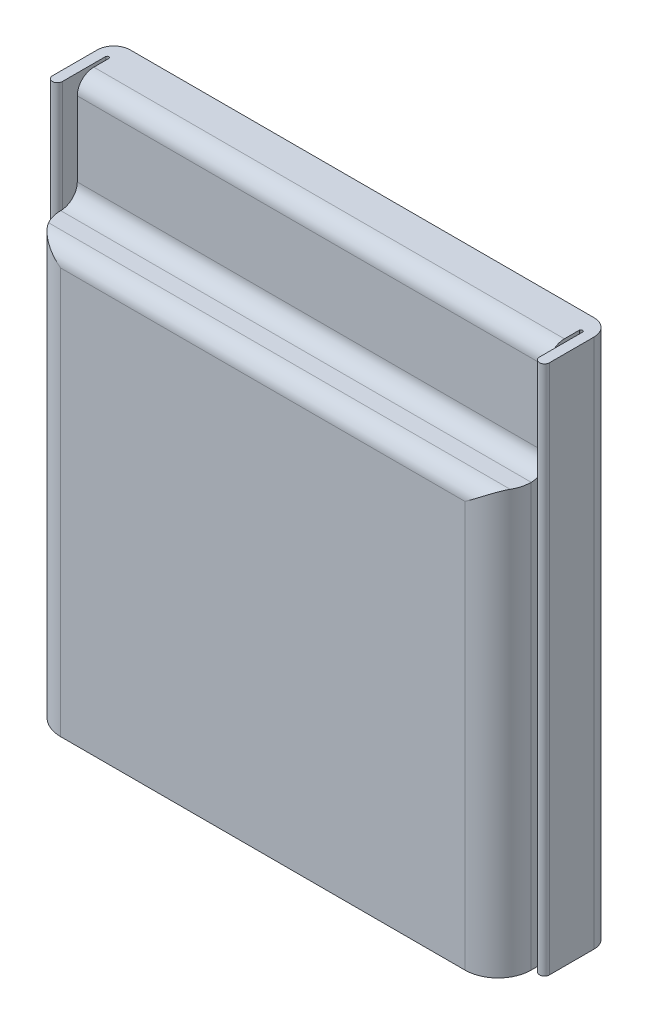
ISO-10303-21;
HEADER;
FILE_DESCRIPTION(('STEP AP214'),'2;1');
FILE_NAME('part.step','',(''),(''),'','','');
FILE_SCHEMA(('AUTOMOTIVE_DESIGN { 1 0 10303 214 1 1 1 1 }'));
ENDSEC;
DATA;
#1=APPLICATION_CONTEXT('core data for automotive mechanical design processes');
#2=APPLICATION_PROTOCOL_DEFINITION('international standard','automotive_design',2000,#1);
#3=PRODUCT_CONTEXT('',#1,'mechanical');
#4=PRODUCT('Part','Part','',(#3));
#5=PRODUCT_RELATED_PRODUCT_CATEGORY('part','',(#4));
#6=PRODUCT_DEFINITION_FORMATION('','',#4);
#7=PRODUCT_DEFINITION_CONTEXT('part definition',#1,'design');
#8=PRODUCT_DEFINITION('design','',#6,#7);
#9=PRODUCT_DEFINITION_SHAPE('','',#8);
#10=(LENGTH_UNIT() NAMED_UNIT(*) SI_UNIT(.MILLI.,.METRE.));
#11=(NAMED_UNIT(*) PLANE_ANGLE_UNIT() SI_UNIT($,.RADIAN.));
#12=(NAMED_UNIT(*) SI_UNIT($,.STERADIAN.) SOLID_ANGLE_UNIT());
#13=UNCERTAINTY_MEASURE_WITH_UNIT(LENGTH_MEASURE(1.E-05),#10,'distance_accuracy_value','');
#14=(GEOMETRIC_REPRESENTATION_CONTEXT(3) GLOBAL_UNCERTAINTY_ASSIGNED_CONTEXT((#13)) GLOBAL_UNIT_ASSIGNED_CONTEXT((#10,
#11,#12)) REPRESENTATION_CONTEXT('',''));
#15=CARTESIAN_POINT('',(0.,0.,0.));
#16=DIRECTION('',(0.,0.,1.));
#17=DIRECTION('',(1.,0.,0.));
#18=AXIS2_PLACEMENT_3D('',#15,#16,#17);
#19=CARTESIAN_POINT('',(-14.2,16.,4.));
#20=DIRECTION('',(1.,0.,0.));
#21=DIRECTION('',(0.,0.,-1.));
#22=AXIS2_PLACEMENT_3D('',#19,#20,#21);
#23=PLANE('',#22);
#24=CARTESIAN_POINT('',(-14.2,15.,2.));
#25=DIRECTION('',(1.,0.,0.));
#26=DIRECTION('',(0.,0.,-1.));
#27=AXIS2_PLACEMENT_3D('',#24,#25,#26);
#28=CIRCLE('',#27,0.999999999999999);
#29=CARTESIAN_POINT('',(-14.2,16.,2.));
#30=VERTEX_POINT('',#29);
#31=CARTESIAN_POINT('',(-14.2,15.,3.));
#32=VERTEX_POINT('',#31);
#33=EDGE_CURVE('E312',#30,#32,#28,.T.);
#34=ORIENTED_EDGE('',*,*,#33,.F.);
#35=DIRECTION('',(0.,0.,1.));
#36=VECTOR('',#35,1.);
#37=CARTESIAN_POINT('',(-14.2,16.,4.));
#38=LINE('',#37,#36);
#39=CARTESIAN_POINT('',(-14.2,16.,1.1));
#40=VERTEX_POINT('',#39);
#41=EDGE_CURVE('E268',#40,#30,#38,.T.);
#42=ORIENTED_EDGE('',*,*,#41,.F.);
#43=DIRECTION('',(0.,-1.,0.));
#44=VECTOR('',#43,1.);
#45=CARTESIAN_POINT('',(-14.2,16.,1.1));
#46=LINE('',#45,#44);
#47=CARTESIAN_POINT('',(-14.2,-16.,1.1));
#48=VERTEX_POINT('',#47);
#49=EDGE_CURVE('E236',#40,#48,#46,.T.);
#50=ORIENTED_EDGE('',*,*,#49,.T.);
#51=DIRECTION('',(0.,0.,1.));
#52=VECTOR('',#51,1.);
#53=CARTESIAN_POINT('',(-14.2,-16.,4.));
#54=LINE('',#53,#52);
#55=CARTESIAN_POINT('',(-14.2,-16.,4.));
#56=VERTEX_POINT('',#55);
#57=EDGE_CURVE('E191',#48,#56,#54,.T.);
#58=ORIENTED_EDGE('',*,*,#57,.T.);
#59=DIRECTION('',(0.,-1.,0.));
#60=VECTOR('',#59,1.);
#61=CARTESIAN_POINT('',(-14.2,16.,4.));
#62=LINE('',#61,#60);
#63=CARTESIAN_POINT('',(-14.2,9.5,4.));
#64=VERTEX_POINT('',#63);
#65=EDGE_CURVE('E234',#64,#56,#62,.T.);
#66=ORIENTED_EDGE('',*,*,#65,.F.);
#67=CARTESIAN_POINT('',(-14.2,10.5,4.));
#68=DIRECTION('',(1.,0.,0.));
#69=DIRECTION('',(0.,0.,-1.));
#70=AXIS2_PLACEMENT_3D('',#67,#68,#69);
#71=CIRCLE('',#70,1.);
#72=CARTESIAN_POINT('',(-14.2,10.5,3.));
#73=VERTEX_POINT('',#72);
#74=EDGE_CURVE('E540',#73,#64,#71,.F.);
#75=ORIENTED_EDGE('',*,*,#74,.F.);
#76=DIRECTION('',(0.,-1.,0.));
#77=VECTOR('',#76,1.);
#78=CARTESIAN_POINT('',(-14.2,15.,3.));
#79=LINE('',#78,#77);
#80=EDGE_CURVE('E545',#32,#73,#79,.T.);
#81=ORIENTED_EDGE('',*,*,#80,.F.);
#82=EDGE_LOOP('',(#34,#42,#50,#58,#66,#75,#81));
#83=FACE_BOUND('',#82,.T.);
#84=ADVANCED_FACE('F34',(#83),#23,.F.);
#85=CARTESIAN_POINT('',(-12.2,16.,4.));
#86=DIRECTION('',(0.,-1.,0.));
#87=DIRECTION('',(0.,0.,-1.));
#88=AXIS2_PLACEMENT_3D('',#85,#86,#87);
#89=CYLINDRICAL_SURFACE('',#88,2.);
#90=CARTESIAN_POINT('',(-13.9320508075689,9.5,5.));
#91=CARTESIAN_POINT('',(-13.9104388092232,9.50000019431164,5.03745955952634));
#92=CARTESIAN_POINT('',(-13.8876150380169,9.49789680203802,5.07416082135288));
#93=CARTESIAN_POINT('',(-13.8399082789937,9.48998659235742,5.14565643679948));
#94=CARTESIAN_POINT('',(-13.8150306479842,9.4841891596109,5.18045538068582));
#95=CARTESIAN_POINT('',(-13.7638095986444,9.46948764080384,5.24750155484404));
#96=CARTESIAN_POINT('',(-13.7374899659552,9.46062573015755,5.27977648315568));
#97=CARTESIAN_POINT('',(-13.6833456141586,9.4402147841779,5.34216028206818));
#98=CARTESIAN_POINT('',(-13.6555197975357,9.42866376857337,5.37226753488461));
#99=CARTESIAN_POINT('',(-13.5593531507906,9.38576723248944,5.47019811807823));
#100=CARTESIAN_POINT('',(-13.4880193488669,9.34907849657492,5.53282562568266));
#101=CARTESIAN_POINT('',(-13.340363739478,9.26681233160586,5.64568917095705));
#102=CARTESIAN_POINT('',(-13.2640143376998,9.22118241178421,5.69584785903709));
#103=CARTESIAN_POINT('',(-13.0766007270823,9.10433459554444,5.80205524109828));
#104=CARTESIAN_POINT('',(-12.9640093602241,9.03024184432857,5.85225042506979));
#105=CARTESIAN_POINT('',(-12.7358987111728,8.87602060504642,5.93063722515178));
#106=CARTESIAN_POINT('',(-12.6203834138029,8.79590006593695,5.9588572812851));
#107=CARTESIAN_POINT('',(-12.4055282598134,8.64531643885113,5.99190926969969));
#108=CARTESIAN_POINT('',(-12.3063744279377,8.57521774765431,5.99962510423665));
#109=CARTESIAN_POINT('',(-12.2048685950783,8.50344261611525,5.99999555089123));
#110=CARTESIAN_POINT('',(-12.2024342684886,8.50172128716943,5.99999999481595));
#111=CARTESIAN_POINT('',(-12.2,8.5,6.));
#112=B_SPLINE_CURVE_WITH_KNOTS('',3,(#90,#91,#92,#93,#94,#95,#96,#97,#98,#99,#100,#101,#102,
#103,#104,#105,#106,#107,#108,#109,#110,#111),.UNSPECIFIED.,.F.,.F.,(4,2,2,2,2,2,2,2,2,2,4),(0.,
0.129592295294554,0.258856668652717,0.38640850926838,0.514054578529991,0.817592410147257,
1.1229686971365,1.55212503753214,1.98072504008938,2.34472916750578,2.35367344935465),.UNSPECIFIED.);
#113=CARTESIAN_POINT('',(-13.9320508075689,9.5,5.));
#114=VERTEX_POINT('',#113);
#115=CARTESIAN_POINT('',(-12.2,8.5,6.));
#116=VERTEX_POINT('',#115);
#117=EDGE_CURVE('E549',#114,#116,#112,.T.);
#118=ORIENTED_EDGE('',*,*,#117,.F.);
#119=CARTESIAN_POINT('',(-12.2,9.5,4.));
#120=DIRECTION('',(0.,-1.,0.));
#121=DIRECTION('',(0.,0.,-1.));
#122=AXIS2_PLACEMENT_3D('',#119,#120,#121);
#123=CIRCLE('',#122,2.);
#124=EDGE_CURVE('E531',#64,#114,#123,.F.);
#125=ORIENTED_EDGE('',*,*,#124,.F.);
#126=ORIENTED_EDGE('',*,*,#65,.T.);
#127=CARTESIAN_POINT('',(-12.2,-16.,4.));
#128=DIRECTION('',(0.,1.,0.));
#129=DIRECTION('',(0.,0.,1.));
#130=AXIS2_PLACEMENT_3D('',#127,#128,#129);
#131=CIRCLE('',#130,2.);
#132=CARTESIAN_POINT('',(-12.2,-16.,6.));
#133=VERTEX_POINT('',#132);
#134=EDGE_CURVE('E194',#56,#133,#131,.T.);
#135=ORIENTED_EDGE('',*,*,#134,.T.);
#136=DIRECTION('',(0.,-1.,0.));
#137=VECTOR('',#136,1.);
#138=CARTESIAN_POINT('',(-12.2,16.,6.));
#139=LINE('',#138,#137);
#140=EDGE_CURVE('E232',#116,#133,#139,.T.);
#141=ORIENTED_EDGE('',*,*,#140,.F.);
#142=EDGE_LOOP('',(#118,#125,#126,#135,#141));
#143=FACE_BOUND('',#142,.T.);
#144=ADVANCED_FACE('F367',(#143),#89,.T.);
#145=CARTESIAN_POINT('',(12.2,16.,4.));
#146=DIRECTION('',(0.,-1.,0.));
#147=DIRECTION('',(0.,0.,-1.));
#148=AXIS2_PLACEMENT_3D('',#145,#146,#147);
#149=CYLINDRICAL_SURFACE('',#148,2.);
#150=CARTESIAN_POINT('',(13.9320508075689,9.5,5.));
#151=CARTESIAN_POINT('',(13.9104388092232,9.50000019431164,5.03745955952635));
#152=CARTESIAN_POINT('',(13.8876150380168,9.49789680203802,5.0741608213529));
#153=CARTESIAN_POINT('',(13.8399082789937,9.48998659235741,5.14565643679952));
#154=CARTESIAN_POINT('',(13.8150306479842,9.48418915961089,5.18045538068586));
#155=CARTESIAN_POINT('',(13.7638095986444,9.46948764080383,5.24750155484409));
#156=CARTESIAN_POINT('',(13.7374899659552,9.46062573015754,5.27977648315572));
#157=CARTESIAN_POINT('',(13.6833456141586,9.4402147841779,5.3421602820682));
#158=CARTESIAN_POINT('',(13.6555197975357,9.42866376857337,5.37226753488462));
#159=CARTESIAN_POINT('',(13.5593531507907,9.38576723248944,5.47019811807823));
#160=CARTESIAN_POINT('',(13.488019348867,9.34907849657491,5.53282562568265));
#161=CARTESIAN_POINT('',(13.3403637394781,9.26681233160589,5.64568917095703));
#162=CARTESIAN_POINT('',(13.2640143376997,9.22118241178428,5.69584785903708));
#163=CARTESIAN_POINT('',(13.0766007270824,9.10433459554433,5.80205524109829));
#164=CARTESIAN_POINT('',(12.9640093602244,9.03024184432811,5.8522504250698));
#165=CARTESIAN_POINT('',(12.7358987111725,8.87602060504685,5.93063722515179));
#166=CARTESIAN_POINT('',(12.6203834138018,8.79590006593861,5.95885728128509));
#167=CARTESIAN_POINT('',(12.4055282598144,8.64531643884971,5.9919092696997));
#168=CARTESIAN_POINT('',(12.3063744279412,8.57521774764938,5.99962510423667));
#169=CARTESIAN_POINT('',(12.2048685950784,8.50344261611501,5.99999555089123));
#170=CARTESIAN_POINT('',(12.2024342684887,8.50172128716931,5.99999999481595));
#171=CARTESIAN_POINT('',(12.2,8.5,6.));
#172=B_SPLINE_CURVE_WITH_KNOTS('',3,(#150,#151,#152,#153,#154,#155,#156,#157,#158,#159,#160,
#161,#162,#163,#164,#165,#166,#167,#168,#169,#170,#171),.UNSPECIFIED.,.F.,.F.,(4,2,2,2,2,2,2,2,
2,2,4),(0.,0.129592295294589,0.258856668652789,0.386408509268417,0.51405457852999,
0.817592410147213,1.1229686971365,1.55212503753219,1.98072504008937,2.34472916750578,
2.35367344935466),.UNSPECIFIED.);
#173=CARTESIAN_POINT('',(13.9320508075689,9.5,5.));
#174=VERTEX_POINT('',#173);
#175=CARTESIAN_POINT('',(12.2,8.5,6.));
#176=VERTEX_POINT('',#175);
#177=EDGE_CURVE('E305',#174,#176,#172,.T.);
#178=ORIENTED_EDGE('',*,*,#177,.T.);
#179=DIRECTION('',(0.,-1.,0.));
#180=VECTOR('',#179,1.);
#181=CARTESIAN_POINT('',(12.2,16.,6.));
#182=LINE('',#181,#180);
#183=CARTESIAN_POINT('',(12.2,-16.,6.));
#184=VERTEX_POINT('',#183);
#185=EDGE_CURVE('E230',#176,#184,#182,.T.);
#186=ORIENTED_EDGE('',*,*,#185,.T.);
#187=CARTESIAN_POINT('',(12.2,-16.,4.));
#188=DIRECTION('',(0.,1.,0.));
#189=DIRECTION('',(0.,0.,-1.));
#190=AXIS2_PLACEMENT_3D('',#187,#188,#189);
#191=CIRCLE('',#190,2.);
#192=CARTESIAN_POINT('',(14.2,-16.,4.));
#193=VERTEX_POINT('',#192);
#194=EDGE_CURVE('E200',#184,#193,#191,.T.);
#195=ORIENTED_EDGE('',*,*,#194,.T.);
#196=DIRECTION('',(0.,-1.,0.));
#197=VECTOR('',#196,1.);
#198=CARTESIAN_POINT('',(14.2,16.,4.));
#199=LINE('',#198,#197);
#200=CARTESIAN_POINT('',(14.2,9.5,4.));
#201=VERTEX_POINT('',#200);
#202=EDGE_CURVE('E228',#201,#193,#199,.T.);
#203=ORIENTED_EDGE('',*,*,#202,.F.);
#204=CARTESIAN_POINT('',(12.2,9.5,4.));
#205=DIRECTION('',(0.,1.,0.));
#206=DIRECTION('',(0.,0.,1.));
#207=AXIS2_PLACEMENT_3D('',#204,#205,#206);
#208=CIRCLE('',#207,2.);
#209=EDGE_CURVE('E535',#201,#174,#208,.F.);
#210=ORIENTED_EDGE('',*,*,#209,.T.);
#211=EDGE_LOOP('',(#178,#186,#195,#203,#210));
#212=FACE_BOUND('',#211,.T.);
#213=ADVANCED_FACE('F363',(#212),#149,.T.);
#214=CARTESIAN_POINT('',(14.2,16.,1.1));
#215=DIRECTION('',(-1.,0.,0.));
#216=DIRECTION('',(0.,0.,1.));
#217=AXIS2_PLACEMENT_3D('',#214,#215,#216);
#218=PLANE('',#217);
#219=CARTESIAN_POINT('',(14.2,15.,2.));
#220=DIRECTION('',(-1.,0.,0.));
#221=DIRECTION('',(0.,0.,1.));
#222=AXIS2_PLACEMENT_3D('',#219,#220,#221);
#223=CIRCLE('',#222,0.999999999999999);
#224=CARTESIAN_POINT('',(14.2,16.,2.));
#225=VERTEX_POINT('',#224);
#226=CARTESIAN_POINT('',(14.2,15.,3.));
#227=VERTEX_POINT('',#226);
#228=EDGE_CURVE('E49',#225,#227,#223,.F.);
#229=ORIENTED_EDGE('',*,*,#228,.T.);
#230=DIRECTION('',(0.,-1.,0.));
#231=VECTOR('',#230,1.);
#232=CARTESIAN_POINT('',(14.2,15.,3.));
#233=LINE('',#232,#231);
#234=CARTESIAN_POINT('',(14.2,10.5,3.));
#235=VERTEX_POINT('',#234);
#236=EDGE_CURVE('E303',#227,#235,#233,.T.);
#237=ORIENTED_EDGE('',*,*,#236,.T.);
#238=CARTESIAN_POINT('',(14.2,10.5,4.));
#239=DIRECTION('',(-1.,0.,0.));
#240=DIRECTION('',(0.,0.,1.));
#241=AXIS2_PLACEMENT_3D('',#238,#239,#240);
#242=CIRCLE('',#241,1.);
#243=EDGE_CURVE('E306',#235,#201,#242,.T.);
#244=ORIENTED_EDGE('',*,*,#243,.T.);
#245=ORIENTED_EDGE('',*,*,#202,.T.);
#246=DIRECTION('',(0.,0.,-1.));
#247=VECTOR('',#246,1.);
#248=CARTESIAN_POINT('',(14.2,-16.,1.1));
#249=LINE('',#248,#247);
#250=CARTESIAN_POINT('',(14.2,-16.,1.1));
#251=VERTEX_POINT('',#250);
#252=EDGE_CURVE('E203',#193,#251,#249,.T.);
#253=ORIENTED_EDGE('',*,*,#252,.T.);
#254=DIRECTION('',(0.,-1.,0.));
#255=VECTOR('',#254,1.);
#256=CARTESIAN_POINT('',(14.2,16.,1.1));
#257=LINE('',#256,#255);
#258=CARTESIAN_POINT('',(14.2,16.,1.1));
#259=VERTEX_POINT('',#258);
#260=EDGE_CURVE('E225',#259,#251,#257,.T.);
#261=ORIENTED_EDGE('',*,*,#260,.F.);
#262=DIRECTION('',(0.,0.,-1.));
#263=VECTOR('',#262,1.);
#264=CARTESIAN_POINT('',(14.2,16.,1.1));
#265=LINE('',#264,#263);
#266=EDGE_CURVE('E271',#225,#259,#265,.T.);
#267=ORIENTED_EDGE('',*,*,#266,.F.);
#268=EDGE_LOOP('',(#229,#237,#244,#245,#253,#261,#267));
#269=FACE_BOUND('',#268,.T.);
#270=ADVANCED_FACE('F360',(#269),#218,.F.);
#271=CARTESIAN_POINT('',(-14.,16.,1.));
#272=DIRECTION('',(0.,-1.,0.));
#273=DIRECTION('',(0.,0.,-1.));
#274=AXIS2_PLACEMENT_3D('',#271,#272,#273);
#275=CYLINDRICAL_SURFACE('',#274,1.);
#276=CARTESIAN_POINT('',(-14.,-16.,1.));
#277=DIRECTION('',(0.,1.,0.));
#278=DIRECTION('',(0.,0.,1.));
#279=AXIS2_PLACEMENT_3D('',#276,#277,#278);
#280=CIRCLE('',#279,1.);
#281=CARTESIAN_POINT('',(-14.,-16.,0.));
#282=VERTEX_POINT('',#281);
#283=CARTESIAN_POINT('',(-15.,-16.,1.));
#284=VERTEX_POINT('',#283);
#285=EDGE_CURVE('E179',#282,#284,#280,.T.);
#286=ORIENTED_EDGE('',*,*,#285,.T.);
#287=DIRECTION('',(0.,-1.,0.));
#288=VECTOR('',#287,1.);
#289=CARTESIAN_POINT('',(-15.,16.,1.));
#290=LINE('',#289,#288);
#291=CARTESIAN_POINT('',(-15.,16.,1.));
#292=VERTEX_POINT('',#291);
#293=EDGE_CURVE('E11',#292,#284,#290,.T.);
#294=ORIENTED_EDGE('',*,*,#293,.F.);
#295=CARTESIAN_POINT('',(-14.,16.,1.));
#296=DIRECTION('',(0.,1.,0.));
#297=DIRECTION('',(0.,0.,1.));
#298=AXIS2_PLACEMENT_3D('',#295,#296,#297);
#299=CIRCLE('',#298,1.);
#300=CARTESIAN_POINT('',(-14.,16.,0.));
#301=VERTEX_POINT('',#300);
#302=EDGE_CURVE('E215',#301,#292,#299,.T.);
#303=ORIENTED_EDGE('',*,*,#302,.F.);
#304=DIRECTION('',(0.,-1.,0.));
#305=VECTOR('',#304,1.);
#306=CARTESIAN_POINT('',(-14.,16.,0.));
#307=LINE('',#306,#305);
#308=EDGE_CURVE('E175',#301,#282,#307,.T.);
#309=ORIENTED_EDGE('',*,*,#308,.T.);
#310=EDGE_LOOP('',(#286,#294,#303,#309));
#311=FACE_BOUND('',#310,.T.);
#312=ADVANCED_FACE('F36',(#311),#275,.T.);
#313=CARTESIAN_POINT('',(-15.,16.,1.));
#314=DIRECTION('',(1.,0.,0.));
#315=DIRECTION('',(0.,0.,-1.));
#316=AXIS2_PLACEMENT_3D('',#313,#314,#315);
#317=PLANE('',#316);
#318=DIRECTION('',(0.,0.,1.));
#319=VECTOR('',#318,1.);
#320=CARTESIAN_POINT('',(-15.,-16.,1.));
#321=LINE('',#320,#319);
#322=CARTESIAN_POINT('',(-15.,-16.,3.7));
#323=VERTEX_POINT('',#322);
#324=EDGE_CURVE('E182',#284,#323,#321,.T.);
#325=ORIENTED_EDGE('',*,*,#324,.T.);
#326=DIRECTION('',(0.,-1.,0.));
#327=VECTOR('',#326,1.);
#328=CARTESIAN_POINT('',(-15.,16.,3.7));
#329=LINE('',#328,#327);
#330=CARTESIAN_POINT('',(-15.,16.,3.7));
#331=VERTEX_POINT('',#330);
#332=EDGE_CURVE('E42',#331,#323,#329,.T.);
#333=ORIENTED_EDGE('',*,*,#332,.F.);
#334=DIRECTION('',(0.,0.,1.));
#335=VECTOR('',#334,1.);
#336=CARTESIAN_POINT('',(-15.,16.,1.));
#337=LINE('',#336,#335);
#338=EDGE_CURVE('E123',#292,#331,#337,.T.);
#339=ORIENTED_EDGE('',*,*,#338,.F.);
#340=ORIENTED_EDGE('',*,*,#293,.T.);
#341=EDGE_LOOP('',(#325,#333,#339,#340));
#342=FACE_BOUND('',#341,.T.);
#343=ADVANCED_FACE('F383',(#342),#317,.F.);
#344=CARTESIAN_POINT('',(-14.7,16.,3.7));
#345=DIRECTION('',(0.,-1.,0.));
#346=DIRECTION('',(0.,0.,-1.));
#347=AXIS2_PLACEMENT_3D('',#344,#345,#346);
#348=CYLINDRICAL_SURFACE('',#347,0.3);
#349=CARTESIAN_POINT('',(-14.7,-16.,3.7));
#350=DIRECTION('',(0.,1.,0.));
#351=DIRECTION('',(0.,0.,1.));
#352=AXIS2_PLACEMENT_3D('',#349,#350,#351);
#353=CIRCLE('',#352,0.3);
#354=CARTESIAN_POINT('',(-14.4,-16.,3.7));
#355=VERTEX_POINT('',#354);
#356=EDGE_CURVE('E185',#323,#355,#353,.T.);
#357=ORIENTED_EDGE('',*,*,#356,.T.);
#358=DIRECTION('',(0.,-1.,0.));
#359=VECTOR('',#358,1.);
#360=CARTESIAN_POINT('',(-14.4,16.,3.7));
#361=LINE('',#360,#359);
#362=CARTESIAN_POINT('',(-14.4,16.,3.7));
#363=VERTEX_POINT('',#362);
#364=EDGE_CURVE('E242',#363,#355,#361,.T.);
#365=ORIENTED_EDGE('',*,*,#364,.F.);
#366=CARTESIAN_POINT('',(-14.7,16.,3.7));
#367=DIRECTION('',(0.,1.,0.));
#368=DIRECTION('',(0.,0.,1.));
#369=AXIS2_PLACEMENT_3D('',#366,#367,#368);
#370=CIRCLE('',#369,0.3);
#371=EDGE_CURVE('E250',#331,#363,#370,.T.);
#372=ORIENTED_EDGE('',*,*,#371,.F.);
#373=ORIENTED_EDGE('',*,*,#332,.T.);
#374=EDGE_LOOP('',(#357,#365,#372,#373));
#375=FACE_BOUND('',#374,.T.);
#376=ADVANCED_FACE('F248',(#375),#348,.T.);
#377=CARTESIAN_POINT('',(-14.4,16.,3.7));
#378=DIRECTION('',(-1.,0.,0.));
#379=DIRECTION('',(0.,0.,1.));
#380=AXIS2_PLACEMENT_3D('',#377,#378,#379);
#381=PLANE('',#380);
#382=DIRECTION('',(0.,0.,-1.));
#383=VECTOR('',#382,1.);
#384=CARTESIAN_POINT('',(-14.4,-16.,3.7));
#385=LINE('',#384,#383);
#386=CARTESIAN_POINT('',(-14.4,-16.,1.1));
#387=VERTEX_POINT('',#386);
#388=EDGE_CURVE('E187',#355,#387,#385,.T.);
#389=ORIENTED_EDGE('',*,*,#388,.T.);
#390=DIRECTION('',(0.,-1.,0.));
#391=VECTOR('',#390,1.);
#392=CARTESIAN_POINT('',(-14.4,16.,1.1));
#393=LINE('',#392,#391);
#394=CARTESIAN_POINT('',(-14.4,16.,1.1));
#395=VERTEX_POINT('',#394);
#396=EDGE_CURVE('E239',#395,#387,#393,.T.);
#397=ORIENTED_EDGE('',*,*,#396,.F.);
#398=DIRECTION('',(0.,0.,-1.));
#399=VECTOR('',#398,1.);
#400=CARTESIAN_POINT('',(-14.4,16.,3.7));
#401=LINE('',#400,#399);
#402=EDGE_CURVE('E269',#363,#395,#401,.T.);
#403=ORIENTED_EDGE('',*,*,#402,.F.);
#404=ORIENTED_EDGE('',*,*,#364,.T.);
#405=EDGE_LOOP('',(#389,#397,#403,#404));
#406=FACE_BOUND('',#405,.T.);
#407=ADVANCED_FACE('F259',(#406),#381,.F.);
#408=CARTESIAN_POINT('',(-14.3,16.,1.1));
#409=DIRECTION('',(0.,-1.,0.));
#410=DIRECTION('',(0.,0.,-1.));
#411=AXIS2_PLACEMENT_3D('',#408,#409,#410);
#412=CYLINDRICAL_SURFACE('',#411,0.100000000000003);
#413=CARTESIAN_POINT('',(-14.3,-16.,1.1));
#414=DIRECTION('',(0.,-1.,0.));
#415=DIRECTION('',(0.,0.,1.));
#416=AXIS2_PLACEMENT_3D('',#413,#414,#415);
#417=CIRCLE('',#416,0.100000000000003);
#418=EDGE_CURVE('E189',#387,#48,#417,.T.);
#419=ORIENTED_EDGE('',*,*,#418,.T.);
#420=ORIENTED_EDGE('',*,*,#49,.F.);
#421=CARTESIAN_POINT('',(-14.3,16.,1.1));
#422=DIRECTION('',(0.,-1.,0.));
#423=DIRECTION('',(0.,0.,1.));
#424=AXIS2_PLACEMENT_3D('',#421,#422,#423);
#425=CIRCLE('',#424,0.100000000000003);
#426=EDGE_CURVE('E265',#395,#40,#425,.T.);
#427=ORIENTED_EDGE('',*,*,#426,.F.);
#428=ORIENTED_EDGE('',*,*,#396,.T.);
#429=EDGE_LOOP('',(#419,#420,#427,#428));
#430=FACE_BOUND('',#429,.T.);
#431=ADVANCED_FACE('F263',(#430),#412,.F.);
#432=CARTESIAN_POINT('',(-12.2,16.,6.));
#433=DIRECTION('',(0.,0.,-1.));
#434=DIRECTION('',(-1.,0.,0.));
#435=AXIS2_PLACEMENT_3D('',#432,#433,#434);
#436=PLANE('',#435);
#437=ORIENTED_EDGE('',*,*,#185,.F.);
#438=DIRECTION('',(-1.,0.,0.));
#439=VECTOR('',#438,1.);
#440=CARTESIAN_POINT('',(15.001,8.5,6.));
#441=LINE('',#440,#439);
#442=EDGE_CURVE('E321',#176,#116,#441,.T.);
#443=ORIENTED_EDGE('',*,*,#442,.T.);
#444=ORIENTED_EDGE('',*,*,#140,.T.);
#445=DIRECTION('',(1.,0.,0.));
#446=VECTOR('',#445,1.);
#447=CARTESIAN_POINT('',(-12.2,-16.,6.));
#448=LINE('',#447,#446);
#449=EDGE_CURVE('E197',#133,#184,#448,.T.);
#450=ORIENTED_EDGE('',*,*,#449,.T.);
#451=EDGE_LOOP('',(#437,#443,#444,#450));
#452=FACE_BOUND('',#451,.T.);
#453=ADVANCED_FACE('F358',(#452),#436,.F.);
#454=CARTESIAN_POINT('',(14.3,16.,1.1));
#455=DIRECTION('',(0.,-1.,0.));
#456=DIRECTION('',(0.,0.,-1.));
#457=AXIS2_PLACEMENT_3D('',#454,#455,#456);
#458=CYLINDRICAL_SURFACE('',#457,0.0999999999999994);
#459=CARTESIAN_POINT('',(14.3,-16.,1.1));
#460=DIRECTION('',(0.,-1.,0.));
#461=DIRECTION('',(0.,0.,-1.));
#462=AXIS2_PLACEMENT_3D('',#459,#460,#461);
#463=CIRCLE('',#462,0.0999999999999994);
#464=CARTESIAN_POINT('',(14.4,-16.,1.1));
#465=VERTEX_POINT('',#464);
#466=EDGE_CURVE('E205',#251,#465,#463,.T.);
#467=ORIENTED_EDGE('',*,*,#466,.T.);
#468=DIRECTION('',(0.,-1.,0.));
#469=VECTOR('',#468,1.);
#470=CARTESIAN_POINT('',(14.4,16.,1.1));
#471=LINE('',#470,#469);
#472=CARTESIAN_POINT('',(14.4,16.,1.1));
#473=VERTEX_POINT('',#472);
#474=EDGE_CURVE('E222',#473,#465,#471,.T.);
#475=ORIENTED_EDGE('',*,*,#474,.F.);
#476=CARTESIAN_POINT('',(14.3,16.,1.1));
#477=DIRECTION('',(0.,-1.,0.));
#478=DIRECTION('',(0.,0.,-1.));
#479=AXIS2_PLACEMENT_3D('',#476,#477,#478);
#480=CIRCLE('',#479,0.0999999999999994);
#481=EDGE_CURVE('E277',#259,#473,#480,.T.);
#482=ORIENTED_EDGE('',*,*,#481,.F.);
#483=ORIENTED_EDGE('',*,*,#260,.T.);
#484=EDGE_LOOP('',(#467,#475,#482,#483));
#485=FACE_BOUND('',#484,.T.);
#486=ADVANCED_FACE('F355',(#485),#458,.F.);
#487=CARTESIAN_POINT('',(14.4,16.,3.7));
#488=DIRECTION('',(1.,0.,0.));
#489=DIRECTION('',(0.,0.,-1.));
#490=AXIS2_PLACEMENT_3D('',#487,#488,#489);
#491=PLANE('',#490);
#492=DIRECTION('',(0.,0.,1.));
#493=VECTOR('',#492,1.);
#494=CARTESIAN_POINT('',(14.4,-16.,3.7));
#495=LINE('',#494,#493);
#496=CARTESIAN_POINT('',(14.4,-16.,3.7));
#497=VERTEX_POINT('',#496);
#498=EDGE_CURVE('E207',#465,#497,#495,.T.);
#499=ORIENTED_EDGE('',*,*,#498,.T.);
#500=DIRECTION('',(0.,-1.,0.));
#501=VECTOR('',#500,1.);
#502=CARTESIAN_POINT('',(14.4,16.,3.7));
#503=LINE('',#502,#501);
#504=CARTESIAN_POINT('',(14.4,16.,3.7));
#505=VERTEX_POINT('',#504);
#506=EDGE_CURVE('E219',#505,#497,#503,.T.);
#507=ORIENTED_EDGE('',*,*,#506,.F.);
#508=DIRECTION('',(0.,0.,1.));
#509=VECTOR('',#508,1.);
#510=CARTESIAN_POINT('',(14.4,16.,3.7));
#511=LINE('',#510,#509);
#512=EDGE_CURVE('E279',#473,#505,#511,.T.);
#513=ORIENTED_EDGE('',*,*,#512,.F.);
#514=ORIENTED_EDGE('',*,*,#474,.T.);
#515=EDGE_LOOP('',(#499,#507,#513,#514));
#516=FACE_BOUND('',#515,.T.);
#517=ADVANCED_FACE('F285',(#516),#491,.F.);
#518=CARTESIAN_POINT('',(14.7,16.,3.7));
#519=DIRECTION('',(0.,-1.,0.));
#520=DIRECTION('',(0.,0.,-1.));
#521=AXIS2_PLACEMENT_3D('',#518,#519,#520);
#522=CYLINDRICAL_SURFACE('',#521,0.300000000000002);
#523=CARTESIAN_POINT('',(14.7,-16.,3.7));
#524=DIRECTION('',(0.,1.,0.));
#525=DIRECTION('',(0.,0.,-1.));
#526=AXIS2_PLACEMENT_3D('',#523,#524,#525);
#527=CIRCLE('',#526,0.300000000000002);
#528=CARTESIAN_POINT('',(15.,-16.,3.7));
#529=VERTEX_POINT('',#528);
#530=EDGE_CURVE('E209',#497,#529,#527,.T.);
#531=ORIENTED_EDGE('',*,*,#530,.T.);
#532=DIRECTION('',(0.,-1.,0.));
#533=VECTOR('',#532,1.);
#534=CARTESIAN_POINT('',(15.,16.,3.7));
#535=LINE('',#534,#533);
#536=CARTESIAN_POINT('',(15.,16.,3.7));
#537=VERTEX_POINT('',#536);
#538=EDGE_CURVE('E170',#537,#529,#535,.T.);
#539=ORIENTED_EDGE('',*,*,#538,.F.);
#540=CARTESIAN_POINT('',(14.7,16.,3.7));
#541=DIRECTION('',(0.,1.,0.));
#542=DIRECTION('',(0.,0.,-1.));
#543=AXIS2_PLACEMENT_3D('',#540,#541,#542);
#544=CIRCLE('',#543,0.300000000000002);
#545=EDGE_CURVE('E158',#505,#537,#544,.T.);
#546=ORIENTED_EDGE('',*,*,#545,.F.);
#547=ORIENTED_EDGE('',*,*,#506,.T.);
#548=EDGE_LOOP('',(#531,#539,#546,#547));
#549=FACE_BOUND('',#548,.T.);
#550=ADVANCED_FACE('F289',(#549),#522,.T.);
#551=CARTESIAN_POINT('',(15.,16.,1.));
#552=DIRECTION('',(-1.,0.,0.));
#553=DIRECTION('',(0.,0.,1.));
#554=AXIS2_PLACEMENT_3D('',#551,#552,#553);
#555=PLANE('',#554);
#556=DIRECTION('',(0.,0.,-1.));
#557=VECTOR('',#556,1.);
#558=CARTESIAN_POINT('',(15.,-16.,1.));
#559=LINE('',#558,#557);
#560=CARTESIAN_POINT('',(15.,-16.,1.));
#561=VERTEX_POINT('',#560);
#562=EDGE_CURVE('E167',#529,#561,#559,.T.);
#563=ORIENTED_EDGE('',*,*,#562,.T.);
#564=DIRECTION('',(0.,-1.,0.));
#565=VECTOR('',#564,1.);
#566=CARTESIAN_POINT('',(15.,16.,1.));
#567=LINE('',#566,#565);
#568=CARTESIAN_POINT('',(15.,16.,1.));
#569=VERTEX_POINT('',#568);
#570=EDGE_CURVE('E164',#569,#561,#567,.T.);
#571=ORIENTED_EDGE('',*,*,#570,.F.);
#572=DIRECTION('',(0.,0.,-1.));
#573=VECTOR('',#572,1.);
#574=CARTESIAN_POINT('',(15.,16.,1.));
#575=LINE('',#574,#573);
#576=EDGE_CURVE('E151',#537,#569,#575,.T.);
#577=ORIENTED_EDGE('',*,*,#576,.F.);
#578=ORIENTED_EDGE('',*,*,#538,.T.);
#579=EDGE_LOOP('',(#563,#571,#577,#578));
#580=FACE_BOUND('',#579,.T.);
#581=ADVANCED_FACE('F165',(#580),#555,.F.);
#582=CARTESIAN_POINT('',(14.,16.,1.));
#583=DIRECTION('',(0.,-1.,0.));
#584=DIRECTION('',(0.,0.,-1.));
#585=AXIS2_PLACEMENT_3D('',#582,#583,#584);
#586=CYLINDRICAL_SURFACE('',#585,1.);
#587=CARTESIAN_POINT('',(14.,-16.,1.));
#588=DIRECTION('',(0.,1.,0.));
#589=DIRECTION('',(0.,0.,-1.));
#590=AXIS2_PLACEMENT_3D('',#587,#588,#589);
#591=CIRCLE('',#590,1.);
#592=CARTESIAN_POINT('',(14.,-16.,0.));
#593=VERTEX_POINT('',#592);
#594=EDGE_CURVE('E212',#561,#593,#591,.T.);
#595=ORIENTED_EDGE('',*,*,#594,.T.);
#596=DIRECTION('',(0.,-1.,0.));
#597=VECTOR('',#596,1.);
#598=CARTESIAN_POINT('',(14.,16.,0.));
#599=LINE('',#598,#597);
#600=CARTESIAN_POINT('',(14.,16.,0.));
#601=VERTEX_POINT('',#600);
#602=EDGE_CURVE('E171',#601,#593,#599,.T.);
#603=ORIENTED_EDGE('',*,*,#602,.F.);
#604=CARTESIAN_POINT('',(14.,16.,1.));
#605=DIRECTION('',(0.,1.,0.));
#606=DIRECTION('',(0.,0.,-1.));
#607=AXIS2_PLACEMENT_3D('',#604,#605,#606);
#608=CIRCLE('',#607,1.);
#609=EDGE_CURVE('E155',#569,#601,#608,.T.);
#610=ORIENTED_EDGE('',*,*,#609,.F.);
#611=ORIENTED_EDGE('',*,*,#570,.T.);
#612=EDGE_LOOP('',(#595,#603,#610,#611));
#613=FACE_BOUND('',#612,.T.);
#614=ADVANCED_FACE('F173',(#613),#586,.T.);
#615=CARTESIAN_POINT('',(-14.,16.,0.));
#616=DIRECTION('',(0.,0.,1.));
#617=DIRECTION('',(1.,0.,0.));
#618=AXIS2_PLACEMENT_3D('',#615,#616,#617);
#619=PLANE('',#618);
#620=DIRECTION('',(-1.,0.,0.));
#621=VECTOR('',#620,1.);
#622=CARTESIAN_POINT('',(-14.,-16.,0.));
#623=LINE('',#622,#621);
#624=EDGE_CURVE('E115',#593,#282,#623,.T.);
#625=ORIENTED_EDGE('',*,*,#624,.T.);
#626=ORIENTED_EDGE('',*,*,#308,.F.);
#627=DIRECTION('',(-1.,0.,0.));
#628=VECTOR('',#627,1.);
#629=CARTESIAN_POINT('',(-14.,16.,0.));
#630=LINE('',#629,#628);
#631=EDGE_CURVE('E58',#601,#301,#630,.T.);
#632=ORIENTED_EDGE('',*,*,#631,.F.);
#633=ORIENTED_EDGE('',*,*,#602,.T.);
#634=EDGE_LOOP('',(#625,#626,#632,#633));
#635=FACE_BOUND('',#634,.T.);
#636=ADVANCED_FACE('F290',(#635),#619,.F.);
#637=CARTESIAN_POINT('',(-14.,16.,1.));
#638=DIRECTION('',(0.,1.,0.));
#639=DIRECTION('',(0.,0.,1.));
#640=AXIS2_PLACEMENT_3D('',#637,#638,#639);
#641=PLANE('',#640);
#642=DIRECTION('',(-1.,0.,0.));
#643=VECTOR('',#642,1.);
#644=CARTESIAN_POINT('',(15.001,16.,2.));
#645=LINE('',#644,#643);
#646=EDGE_CURVE('E300',#225,#30,#645,.T.);
#647=ORIENTED_EDGE('',*,*,#646,.F.);
#648=ORIENTED_EDGE('',*,*,#266,.T.);
#649=ORIENTED_EDGE('',*,*,#481,.T.);
#650=ORIENTED_EDGE('',*,*,#512,.T.);
#651=ORIENTED_EDGE('',*,*,#545,.T.);
#652=ORIENTED_EDGE('',*,*,#576,.T.);
#653=ORIENTED_EDGE('',*,*,#609,.T.);
#654=ORIENTED_EDGE('',*,*,#631,.T.);
#655=ORIENTED_EDGE('',*,*,#302,.T.);
#656=ORIENTED_EDGE('',*,*,#338,.T.);
#657=ORIENTED_EDGE('',*,*,#371,.T.);
#658=ORIENTED_EDGE('',*,*,#402,.T.);
#659=ORIENTED_EDGE('',*,*,#426,.T.);
#660=ORIENTED_EDGE('',*,*,#41,.T.);
#661=EDGE_LOOP('',(#647,#648,#649,#650,#651,#652,#653,#654,#655,#656,#657,#658,#659,#660));
#662=FACE_BOUND('',#661,.T.);
#663=ADVANCED_FACE('F153',(#662),#641,.T.);
#664=CARTESIAN_POINT('',(-14.,-16.,1.));
#665=DIRECTION('',(0.,1.,0.));
#666=DIRECTION('',(0.,0.,1.));
#667=AXIS2_PLACEMENT_3D('',#664,#665,#666);
#668=PLANE('',#667);
#669=ORIENTED_EDGE('',*,*,#285,.F.);
#670=ORIENTED_EDGE('',*,*,#624,.F.);
#671=ORIENTED_EDGE('',*,*,#594,.F.);
#672=ORIENTED_EDGE('',*,*,#562,.F.);
#673=ORIENTED_EDGE('',*,*,#530,.F.);
#674=ORIENTED_EDGE('',*,*,#498,.F.);
#675=ORIENTED_EDGE('',*,*,#466,.F.);
#676=ORIENTED_EDGE('',*,*,#252,.F.);
#677=ORIENTED_EDGE('',*,*,#194,.F.);
#678=ORIENTED_EDGE('',*,*,#449,.F.);
#679=ORIENTED_EDGE('',*,*,#134,.F.);
#680=ORIENTED_EDGE('',*,*,#57,.F.);
#681=ORIENTED_EDGE('',*,*,#418,.F.);
#682=ORIENTED_EDGE('',*,*,#388,.F.);
#683=ORIENTED_EDGE('',*,*,#356,.F.);
#684=ORIENTED_EDGE('',*,*,#324,.F.);
#685=EDGE_LOOP('',(#669,#670,#671,#672,#673,#674,#675,#676,#677,#678,#679,#680,#681,#682,#683,#684));
#686=FACE_BOUND('',#685,.T.);
#687=ADVANCED_FACE('F254',(#686),#668,.F.);
#688=CARTESIAN_POINT('',(15.001,15.,2.));
#689=DIRECTION('',(-1.,0.,0.));
#690=DIRECTION('',(0.,0.,1.));
#691=AXIS2_PLACEMENT_3D('',#688,#689,#690);
#692=CYLINDRICAL_SURFACE('',#691,0.999999999999999);
#693=ORIENTED_EDGE('',*,*,#646,.T.);
#694=ORIENTED_EDGE('',*,*,#33,.T.);
#695=DIRECTION('',(-1.,0.,0.));
#696=VECTOR('',#695,1.);
#697=CARTESIAN_POINT('',(15.001,15.,3.));
#698=LINE('',#697,#696);
#699=EDGE_CURVE('E297',#227,#32,#698,.T.);
#700=ORIENTED_EDGE('',*,*,#699,.F.);
#701=ORIENTED_EDGE('',*,*,#228,.F.);
#702=EDGE_LOOP('',(#693,#694,#700,#701));
#703=FACE_BOUND('',#702,.T.);
#704=ADVANCED_FACE('F338',(#703),#692,.T.);
#705=CARTESIAN_POINT('',(15.001,8.5,5.));
#706=DIRECTION('',(-1.,0.,0.));
#707=DIRECTION('',(0.,0.,1.));
#708=AXIS2_PLACEMENT_3D('',#705,#706,#707);
#709=CYLINDRICAL_SURFACE('',#708,1.);
#710=DIRECTION('',(-1.,0.,0.));
#711=VECTOR('',#710,1.);
#712=CARTESIAN_POINT('',(15.001,9.5,5.));
#713=LINE('',#712,#711);
#714=EDGE_CURVE('E310',#174,#114,#713,.T.);
#715=ORIENTED_EDGE('',*,*,#714,.T.);
#716=ORIENTED_EDGE('',*,*,#117,.T.);
#717=ORIENTED_EDGE('',*,*,#442,.F.);
#718=ORIENTED_EDGE('',*,*,#177,.F.);
#719=EDGE_LOOP('',(#715,#716,#717,#718));
#720=FACE_BOUND('',#719,.T.);
#721=ADVANCED_FACE('F323',(#720),#709,.T.);
#722=CARTESIAN_POINT('',(15.001,9.5,4.));
#723=DIRECTION('',(0.,1.,0.));
#724=DIRECTION('',(0.,0.,1.));
#725=AXIS2_PLACEMENT_3D('',#722,#723,#724);
#726=PLANE('',#725);
#727=DIRECTION('',(-1.,0.,0.));
#728=VECTOR('',#727,1.);
#729=CARTESIAN_POINT('',(15.001,9.5,4.));
#730=LINE('',#729,#728);
#731=EDGE_CURVE('E309',#201,#64,#730,.T.);
#732=ORIENTED_EDGE('',*,*,#731,.T.);
#733=ORIENTED_EDGE('',*,*,#124,.T.);
#734=ORIENTED_EDGE('',*,*,#714,.F.);
#735=ORIENTED_EDGE('',*,*,#209,.F.);
#736=EDGE_LOOP('',(#732,#733,#734,#735));
#737=FACE_BOUND('',#736,.T.);
#738=ADVANCED_FACE('F329',(#737),#726,.T.);
#739=CARTESIAN_POINT('',(15.001,10.5,4.));
#740=DIRECTION('',(-1.,0.,0.));
#741=DIRECTION('',(0.,0.,1.));
#742=AXIS2_PLACEMENT_3D('',#739,#740,#741);
#743=CYLINDRICAL_SURFACE('',#742,1.);
#744=DIRECTION('',(-1.,0.,0.));
#745=VECTOR('',#744,1.);
#746=CARTESIAN_POINT('',(15.001,10.5,3.));
#747=LINE('',#746,#745);
#748=EDGE_CURVE('E183',#235,#73,#747,.T.);
#749=ORIENTED_EDGE('',*,*,#748,.T.);
#750=ORIENTED_EDGE('',*,*,#74,.T.);
#751=ORIENTED_EDGE('',*,*,#731,.F.);
#752=ORIENTED_EDGE('',*,*,#243,.F.);
#753=EDGE_LOOP('',(#749,#750,#751,#752));
#754=FACE_BOUND('',#753,.T.);
#755=ADVANCED_FACE('F333',(#754),#743,.F.);
#756=CARTESIAN_POINT('',(15.001,15.,3.));
#757=DIRECTION('',(0.,0.,1.));
#758=DIRECTION('',(1.,0.,0.));
#759=AXIS2_PLACEMENT_3D('',#756,#757,#758);
#760=PLANE('',#759);
#761=ORIENTED_EDGE('',*,*,#699,.T.);
#762=ORIENTED_EDGE('',*,*,#80,.T.);
#763=ORIENTED_EDGE('',*,*,#748,.F.);
#764=ORIENTED_EDGE('',*,*,#236,.F.);
#765=EDGE_LOOP('',(#761,#762,#763,#764));
#766=FACE_BOUND('',#765,.T.);
#767=ADVANCED_FACE('F330',(#766),#760,.T.);
#768=CLOSED_SHELL('',(#84,#144,#213,#270,#312,#343,#376,#407,#431,#453,#486,#517,#550,#581,#614,
#636,#663,#687,#704,#721,#738,#755,#767));
#769=MANIFOLD_SOLID_BREP('B2',#768);
#770=ADVANCED_BREP_SHAPE_REPRESENTATION('',(#18,#769),#14);
#771=SHAPE_DEFINITION_REPRESENTATION(#9,#770);
ENDSEC;
END-ISO-10303-21;
